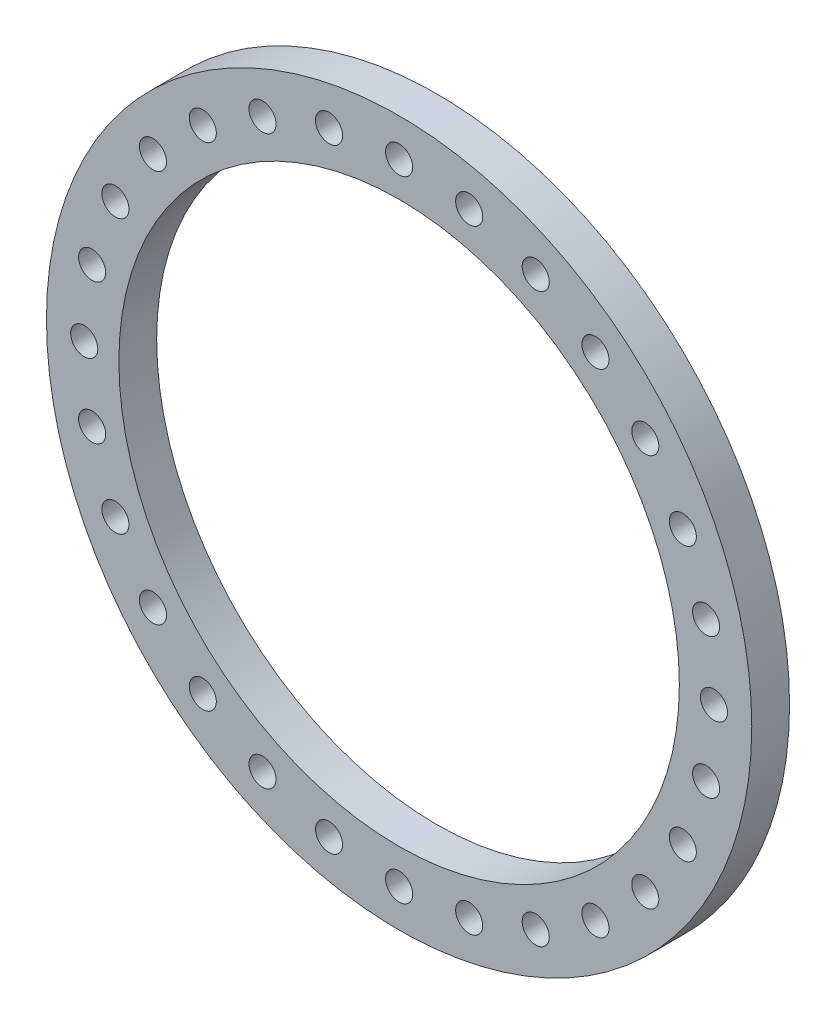
ISO-10303-21;
HEADER;
FILE_DESCRIPTION(('STEP AP214'),'2;1');
FILE_NAME('part.step','',(''),(''),'','','');
FILE_SCHEMA(('AUTOMOTIVE_DESIGN { 1 0 10303 214 1 1 1 1 }'));
ENDSEC;
DATA;
#1=APPLICATION_CONTEXT('core data for automotive mechanical design processes');
#2=APPLICATION_PROTOCOL_DEFINITION('international standard','automotive_design',2000,#1);
#3=PRODUCT_CONTEXT('',#1,'mechanical');
#4=PRODUCT('Part','Part','',(#3));
#5=PRODUCT_RELATED_PRODUCT_CATEGORY('part','',(#4));
#6=PRODUCT_DEFINITION_FORMATION('','',#4);
#7=PRODUCT_DEFINITION_CONTEXT('part definition',#1,'design');
#8=PRODUCT_DEFINITION('design','',#6,#7);
#9=PRODUCT_DEFINITION_SHAPE('','',#8);
#10=(LENGTH_UNIT() NAMED_UNIT(*) SI_UNIT(.MILLI.,.METRE.));
#11=(NAMED_UNIT(*) PLANE_ANGLE_UNIT() SI_UNIT($,.RADIAN.));
#12=(NAMED_UNIT(*) SI_UNIT($,.STERADIAN.) SOLID_ANGLE_UNIT());
#13=UNCERTAINTY_MEASURE_WITH_UNIT(LENGTH_MEASURE(1.E-05),#10,'distance_accuracy_value','');
#14=(GEOMETRIC_REPRESENTATION_CONTEXT(3) GLOBAL_UNCERTAINTY_ASSIGNED_CONTEXT((#13)) GLOBAL_UNIT_ASSIGNED_CONTEXT((#10,
#11,#12)) REPRESENTATION_CONTEXT('',''));
#15=CARTESIAN_POINT('',(0.,0.,0.));
#16=DIRECTION('',(0.,0.,1.));
#17=DIRECTION('',(1.,0.,0.));
#18=AXIS2_PLACEMENT_3D('',#15,#16,#17);
#19=CARTESIAN_POINT('',(0.,0.,6.));
#20=DIRECTION('',(0.,0.,-1.));
#21=DIRECTION('',(-1.,0.,0.));
#22=AXIS2_PLACEMENT_3D('',#19,#20,#21);
#23=CYLINDRICAL_SURFACE('',#22,56.);
#24=CARTESIAN_POINT('',(0.,0.,6.));
#25=DIRECTION('',(0.,0.,-1.));
#26=DIRECTION('',(1.,0.,0.));
#27=AXIS2_PLACEMENT_3D('',#24,#25,#26);
#28=CIRCLE('',#27,56.);
#29=CARTESIAN_POINT('',(56.,0.,6.));
#30=VERTEX_POINT('',#29);
#31=EDGE_CURVE('E10',#30,#30,#28,.T.);
#32=ORIENTED_EDGE('',*,*,#31,.T.);
#33=EDGE_LOOP('',(#32));
#34=FACE_BOUND('',#33,.T.);
#35=CARTESIAN_POINT('',(0.,0.,0.));
#36=DIRECTION('',(0.,0.,-1.));
#37=DIRECTION('',(1.,0.,0.));
#38=AXIS2_PLACEMENT_3D('',#35,#36,#37);
#39=CIRCLE('',#38,56.);
#40=CARTESIAN_POINT('',(56.,0.,0.));
#41=VERTEX_POINT('',#40);
#42=EDGE_CURVE('E42',#41,#41,#39,.T.);
#43=ORIENTED_EDGE('',*,*,#42,.F.);
#44=EDGE_LOOP('',(#43));
#45=FACE_BOUND('',#44,.T.);
#46=ADVANCED_FACE('F39',(#34,#45),#23,.T.);
#47=CARTESIAN_POINT('',(0.,0.,6.));
#48=DIRECTION('',(0.,0.,1.));
#49=DIRECTION('',(1.,0.,0.));
#50=AXIS2_PLACEMENT_3D('',#47,#48,#49);
#51=PLANE('',#50);
#52=CARTESIAN_POINT('',(0.,0.,6.));
#53=DIRECTION('',(0.,0.,-1.));
#54=DIRECTION('',(1.,0.,0.));
#55=AXIS2_PLACEMENT_3D('',#52,#53,#54);
#56=CIRCLE('',#55,44.5);
#57=CARTESIAN_POINT('',(44.5,0.,6.));
#58=VERTEX_POINT('',#57);
#59=EDGE_CURVE('E216',#58,#58,#56,.T.);
#60=ORIENTED_EDGE('',*,*,#59,.T.);
#61=EDGE_LOOP('',(#60));
#62=FACE_BOUND('',#61,.T.);
#63=CARTESIAN_POINT('',(0.,50.,6.));
#64=DIRECTION('',(0.,0.,-1.));
#65=DIRECTION('',(1.,0.,0.));
#66=AXIS2_PLACEMENT_3D('',#63,#64,#65);
#67=CIRCLE('',#66,2.15);
#68=CARTESIAN_POINT('',(2.15,50.,6.));
#69=VERTEX_POINT('',#68);
#70=EDGE_CURVE('E210',#69,#69,#67,.T.);
#71=ORIENTED_EDGE('',*,*,#70,.T.);
#72=EDGE_LOOP('',(#71));
#73=FACE_BOUND('',#72,.T.);
#74=CARTESIAN_POINT('',(11.1260466978157,48.7463956090912,6.));
#75=DIRECTION('',(0.,0.,-1.));
#76=DIRECTION('',(1.,0.,0.));
#77=AXIS2_PLACEMENT_3D('',#74,#75,#76);
#78=CIRCLE('',#77,2.15);
#79=CARTESIAN_POINT('',(13.2760466978157,48.7463956090912,6.));
#80=VERTEX_POINT('',#79);
#81=EDGE_CURVE('E204',#80,#80,#78,.T.);
#82=ORIENTED_EDGE('',*,*,#81,.T.);
#83=EDGE_LOOP('',(#82));
#84=FACE_BOUND('',#83,.T.);
#85=CARTESIAN_POINT('',(21.6941869558779,45.048443395121,6.));
#86=DIRECTION('',(0.,0.,-1.));
#87=DIRECTION('',(1.,0.,0.));
#88=AXIS2_PLACEMENT_3D('',#85,#86,#87);
#89=CIRCLE('',#88,2.15);
#90=CARTESIAN_POINT('',(23.8441869558779,45.048443395121,6.));
#91=VERTEX_POINT('',#90);
#92=EDGE_CURVE('E198',#91,#91,#89,.T.);
#93=ORIENTED_EDGE('',*,*,#92,.T.);
#94=EDGE_LOOP('',(#93));
#95=FACE_BOUND('',#94,.T.);
#96=CARTESIAN_POINT('',(31.1744900929367,39.0915741234015,6.));
#97=DIRECTION('',(0.,0.,-1.));
#98=DIRECTION('',(1.,0.,0.));
#99=AXIS2_PLACEMENT_3D('',#96,#97,#98);
#100=CIRCLE('',#99,2.15);
#101=CARTESIAN_POINT('',(33.3244900929367,39.0915741234015,6.));
#102=VERTEX_POINT('',#101);
#103=EDGE_CURVE('E192',#102,#102,#100,.T.);
#104=ORIENTED_EDGE('',*,*,#103,.T.);
#105=EDGE_LOOP('',(#104));
#106=FACE_BOUND('',#105,.T.);
#107=CARTESIAN_POINT('',(39.0915741234015,31.1744900929367,6.));
#108=DIRECTION('',(0.,0.,-1.));
#109=DIRECTION('',(1.,0.,0.));
#110=AXIS2_PLACEMENT_3D('',#107,#108,#109);
#111=CIRCLE('',#110,2.15);
#112=CARTESIAN_POINT('',(41.2415741234015,31.1744900929367,6.));
#113=VERTEX_POINT('',#112);
#114=EDGE_CURVE('E186',#113,#113,#111,.T.);
#115=ORIENTED_EDGE('',*,*,#114,.T.);
#116=EDGE_LOOP('',(#115));
#117=FACE_BOUND('',#116,.T.);
#118=CARTESIAN_POINT('',(45.048443395121,21.6941869558779,6.));
#119=DIRECTION('',(0.,0.,-1.));
#120=DIRECTION('',(1.,0.,0.));
#121=AXIS2_PLACEMENT_3D('',#118,#119,#120);
#122=CIRCLE('',#121,2.15);
#123=CARTESIAN_POINT('',(47.198443395121,21.6941869558779,6.));
#124=VERTEX_POINT('',#123);
#125=EDGE_CURVE('E180',#124,#124,#122,.T.);
#126=ORIENTED_EDGE('',*,*,#125,.T.);
#127=EDGE_LOOP('',(#126));
#128=FACE_BOUND('',#127,.T.);
#129=CARTESIAN_POINT('',(48.7463956090912,11.1260466978157,6.));
#130=DIRECTION('',(0.,0.,-1.));
#131=DIRECTION('',(1.,0.,0.));
#132=AXIS2_PLACEMENT_3D('',#129,#130,#131);
#133=CIRCLE('',#132,2.15);
#134=CARTESIAN_POINT('',(50.8963956090912,11.1260466978157,6.));
#135=VERTEX_POINT('',#134);
#136=EDGE_CURVE('E174',#135,#135,#133,.T.);
#137=ORIENTED_EDGE('',*,*,#136,.T.);
#138=EDGE_LOOP('',(#137));
#139=FACE_BOUND('',#138,.T.);
#140=CARTESIAN_POINT('',(50.,0.,6.));
#141=DIRECTION('',(0.,0.,-1.));
#142=DIRECTION('',(1.,0.,0.));
#143=AXIS2_PLACEMENT_3D('',#140,#141,#142);
#144=CIRCLE('',#143,2.15);
#145=CARTESIAN_POINT('',(52.15,0.,6.));
#146=VERTEX_POINT('',#145);
#147=EDGE_CURVE('E168',#146,#146,#144,.T.);
#148=ORIENTED_EDGE('',*,*,#147,.T.);
#149=EDGE_LOOP('',(#148));
#150=FACE_BOUND('',#149,.T.);
#151=CARTESIAN_POINT('',(48.7463956090912,-11.1260466978157,6.));
#152=DIRECTION('',(0.,0.,-1.));
#153=DIRECTION('',(1.,0.,0.));
#154=AXIS2_PLACEMENT_3D('',#151,#152,#153);
#155=CIRCLE('',#154,2.15);
#156=CARTESIAN_POINT('',(50.8963956090912,-11.1260466978157,6.));
#157=VERTEX_POINT('',#156);
#158=EDGE_CURVE('E162',#157,#157,#155,.T.);
#159=ORIENTED_EDGE('',*,*,#158,.T.);
#160=EDGE_LOOP('',(#159));
#161=FACE_BOUND('',#160,.T.);
#162=CARTESIAN_POINT('',(45.048443395121,-21.6941869558779,6.));
#163=DIRECTION('',(0.,0.,-1.));
#164=DIRECTION('',(1.,0.,0.));
#165=AXIS2_PLACEMENT_3D('',#162,#163,#164);
#166=CIRCLE('',#165,2.15);
#167=CARTESIAN_POINT('',(47.198443395121,-21.6941869558779,6.));
#168=VERTEX_POINT('',#167);
#169=EDGE_CURVE('E156',#168,#168,#166,.T.);
#170=ORIENTED_EDGE('',*,*,#169,.T.);
#171=EDGE_LOOP('',(#170));
#172=FACE_BOUND('',#171,.T.);
#173=CARTESIAN_POINT('',(39.0915741234015,-31.1744900929367,6.));
#174=DIRECTION('',(0.,0.,-1.));
#175=DIRECTION('',(1.,0.,0.));
#176=AXIS2_PLACEMENT_3D('',#173,#174,#175);
#177=CIRCLE('',#176,2.15);
#178=CARTESIAN_POINT('',(41.2415741234015,-31.1744900929367,6.));
#179=VERTEX_POINT('',#178);
#180=EDGE_CURVE('E150',#179,#179,#177,.T.);
#181=ORIENTED_EDGE('',*,*,#180,.T.);
#182=EDGE_LOOP('',(#181));
#183=FACE_BOUND('',#182,.T.);
#184=CARTESIAN_POINT('',(31.1744900929367,-39.0915741234015,6.));
#185=DIRECTION('',(0.,0.,-1.));
#186=DIRECTION('',(1.,0.,0.));
#187=AXIS2_PLACEMENT_3D('',#184,#185,#186);
#188=CIRCLE('',#187,2.15);
#189=CARTESIAN_POINT('',(33.3244900929367,-39.0915741234015,6.));
#190=VERTEX_POINT('',#189);
#191=EDGE_CURVE('E144',#190,#190,#188,.T.);
#192=ORIENTED_EDGE('',*,*,#191,.T.);
#193=EDGE_LOOP('',(#192));
#194=FACE_BOUND('',#193,.T.);
#195=CARTESIAN_POINT('',(21.6941869558779,-45.048443395121,6.));
#196=DIRECTION('',(0.,0.,-1.));
#197=DIRECTION('',(1.,0.,0.));
#198=AXIS2_PLACEMENT_3D('',#195,#196,#197);
#199=CIRCLE('',#198,2.15);
#200=CARTESIAN_POINT('',(23.8441869558779,-45.048443395121,6.));
#201=VERTEX_POINT('',#200);
#202=EDGE_CURVE('E138',#201,#201,#199,.T.);
#203=ORIENTED_EDGE('',*,*,#202,.T.);
#204=EDGE_LOOP('',(#203));
#205=FACE_BOUND('',#204,.T.);
#206=CARTESIAN_POINT('',(11.1260466978157,-48.7463956090912,6.));
#207=DIRECTION('',(0.,0.,-1.));
#208=DIRECTION('',(1.,0.,0.));
#209=AXIS2_PLACEMENT_3D('',#206,#207,#208);
#210=CIRCLE('',#209,2.15);
#211=CARTESIAN_POINT('',(13.2760466978157,-48.7463956090912,6.));
#212=VERTEX_POINT('',#211);
#213=EDGE_CURVE('E132',#212,#212,#210,.T.);
#214=ORIENTED_EDGE('',*,*,#213,.T.);
#215=EDGE_LOOP('',(#214));
#216=FACE_BOUND('',#215,.T.);
#217=CARTESIAN_POINT('',(0.,-50.,6.));
#218=DIRECTION('',(0.,0.,-1.));
#219=DIRECTION('',(1.,0.,0.));
#220=AXIS2_PLACEMENT_3D('',#217,#218,#219);
#221=CIRCLE('',#220,2.15);
#222=CARTESIAN_POINT('',(2.15000000000001,-50.,6.));
#223=VERTEX_POINT('',#222);
#224=EDGE_CURVE('E126',#223,#223,#221,.T.);
#225=ORIENTED_EDGE('',*,*,#224,.T.);
#226=EDGE_LOOP('',(#225));
#227=FACE_BOUND('',#226,.T.);
#228=CARTESIAN_POINT('',(-11.1260466978157,-48.7463956090912,6.));
#229=DIRECTION('',(0.,0.,-1.));
#230=DIRECTION('',(1.,0.,0.));
#231=AXIS2_PLACEMENT_3D('',#228,#229,#230);
#232=CIRCLE('',#231,2.15);
#233=CARTESIAN_POINT('',(-8.9760466978157,-48.7463956090912,6.));
#234=VERTEX_POINT('',#233);
#235=EDGE_CURVE('E120',#234,#234,#232,.T.);
#236=ORIENTED_EDGE('',*,*,#235,.T.);
#237=EDGE_LOOP('',(#236));
#238=FACE_BOUND('',#237,.T.);
#239=CARTESIAN_POINT('',(-21.6941869558779,-45.048443395121,6.));
#240=DIRECTION('',(0.,0.,-1.));
#241=DIRECTION('',(1.,0.,0.));
#242=AXIS2_PLACEMENT_3D('',#239,#240,#241);
#243=CIRCLE('',#242,2.15);
#244=CARTESIAN_POINT('',(-19.5441869558779,-45.048443395121,6.));
#245=VERTEX_POINT('',#244);
#246=EDGE_CURVE('E114',#245,#245,#243,.T.);
#247=ORIENTED_EDGE('',*,*,#246,.T.);
#248=EDGE_LOOP('',(#247));
#249=FACE_BOUND('',#248,.T.);
#250=CARTESIAN_POINT('',(-31.1744900929367,-39.0915741234015,6.));
#251=DIRECTION('',(0.,0.,-1.));
#252=DIRECTION('',(1.,0.,0.));
#253=AXIS2_PLACEMENT_3D('',#250,#251,#252);
#254=CIRCLE('',#253,2.15);
#255=CARTESIAN_POINT('',(-29.0244900929367,-39.0915741234015,6.));
#256=VERTEX_POINT('',#255);
#257=EDGE_CURVE('E108',#256,#256,#254,.T.);
#258=ORIENTED_EDGE('',*,*,#257,.T.);
#259=EDGE_LOOP('',(#258));
#260=FACE_BOUND('',#259,.T.);
#261=CARTESIAN_POINT('',(-39.0915741234015,-31.1744900929367,6.));
#262=DIRECTION('',(0.,0.,-1.));
#263=DIRECTION('',(1.,0.,0.));
#264=AXIS2_PLACEMENT_3D('',#261,#262,#263);
#265=CIRCLE('',#264,2.15);
#266=CARTESIAN_POINT('',(-36.9415741234015,-31.1744900929367,6.));
#267=VERTEX_POINT('',#266);
#268=EDGE_CURVE('E102',#267,#267,#265,.T.);
#269=ORIENTED_EDGE('',*,*,#268,.T.);
#270=EDGE_LOOP('',(#269));
#271=FACE_BOUND('',#270,.T.);
#272=CARTESIAN_POINT('',(-45.048443395121,-21.6941869558779,6.));
#273=DIRECTION('',(0.,0.,-1.));
#274=DIRECTION('',(1.,0.,0.));
#275=AXIS2_PLACEMENT_3D('',#272,#273,#274);
#276=CIRCLE('',#275,2.15);
#277=CARTESIAN_POINT('',(-42.898443395121,-21.6941869558779,6.));
#278=VERTEX_POINT('',#277);
#279=EDGE_CURVE('E96',#278,#278,#276,.T.);
#280=ORIENTED_EDGE('',*,*,#279,.T.);
#281=EDGE_LOOP('',(#280));
#282=FACE_BOUND('',#281,.T.);
#283=CARTESIAN_POINT('',(-48.7463956090912,-11.1260466978157,6.));
#284=DIRECTION('',(0.,0.,-1.));
#285=DIRECTION('',(1.,0.,0.));
#286=AXIS2_PLACEMENT_3D('',#283,#284,#285);
#287=CIRCLE('',#286,2.15);
#288=CARTESIAN_POINT('',(-46.5963956090912,-11.1260466978157,6.));
#289=VERTEX_POINT('',#288);
#290=EDGE_CURVE('E90',#289,#289,#287,.T.);
#291=ORIENTED_EDGE('',*,*,#290,.T.);
#292=EDGE_LOOP('',(#291));
#293=FACE_BOUND('',#292,.T.);
#294=CARTESIAN_POINT('',(-50.,0.,6.));
#295=DIRECTION('',(0.,0.,-1.));
#296=DIRECTION('',(1.,0.,0.));
#297=AXIS2_PLACEMENT_3D('',#294,#295,#296);
#298=CIRCLE('',#297,2.15);
#299=CARTESIAN_POINT('',(-47.85,0.,6.));
#300=VERTEX_POINT('',#299);
#301=EDGE_CURVE('E84',#300,#300,#298,.T.);
#302=ORIENTED_EDGE('',*,*,#301,.T.);
#303=EDGE_LOOP('',(#302));
#304=FACE_BOUND('',#303,.T.);
#305=CARTESIAN_POINT('',(-48.7463956090912,11.1260466978157,6.));
#306=DIRECTION('',(0.,0.,-1.));
#307=DIRECTION('',(1.,0.,0.));
#308=AXIS2_PLACEMENT_3D('',#305,#306,#307);
#309=CIRCLE('',#308,2.15);
#310=CARTESIAN_POINT('',(-46.5963956090912,11.1260466978157,6.));
#311=VERTEX_POINT('',#310);
#312=EDGE_CURVE('E78',#311,#311,#309,.T.);
#313=ORIENTED_EDGE('',*,*,#312,.T.);
#314=EDGE_LOOP('',(#313));
#315=FACE_BOUND('',#314,.T.);
#316=CARTESIAN_POINT('',(-45.048443395121,21.6941869558779,6.));
#317=DIRECTION('',(0.,0.,-1.));
#318=DIRECTION('',(1.,0.,0.));
#319=AXIS2_PLACEMENT_3D('',#316,#317,#318);
#320=CIRCLE('',#319,2.15);
#321=CARTESIAN_POINT('',(-42.898443395121,21.6941869558779,6.));
#322=VERTEX_POINT('',#321);
#323=EDGE_CURVE('E72',#322,#322,#320,.T.);
#324=ORIENTED_EDGE('',*,*,#323,.T.);
#325=EDGE_LOOP('',(#324));
#326=FACE_BOUND('',#325,.T.);
#327=CARTESIAN_POINT('',(-39.0915741234015,31.1744900929367,6.));
#328=DIRECTION('',(0.,0.,-1.));
#329=DIRECTION('',(1.,0.,0.));
#330=AXIS2_PLACEMENT_3D('',#327,#328,#329);
#331=CIRCLE('',#330,2.15);
#332=CARTESIAN_POINT('',(-36.9415741234015,31.1744900929367,6.));
#333=VERTEX_POINT('',#332);
#334=EDGE_CURVE('E66',#333,#333,#331,.T.);
#335=ORIENTED_EDGE('',*,*,#334,.T.);
#336=EDGE_LOOP('',(#335));
#337=FACE_BOUND('',#336,.T.);
#338=CARTESIAN_POINT('',(-31.1744900929367,39.0915741234015,6.));
#339=DIRECTION('',(0.,0.,-1.));
#340=DIRECTION('',(1.,0.,0.));
#341=AXIS2_PLACEMENT_3D('',#338,#339,#340);
#342=CIRCLE('',#341,2.15);
#343=CARTESIAN_POINT('',(-29.0244900929367,39.0915741234015,6.));
#344=VERTEX_POINT('',#343);
#345=EDGE_CURVE('E60',#344,#344,#342,.T.);
#346=ORIENTED_EDGE('',*,*,#345,.T.);
#347=EDGE_LOOP('',(#346));
#348=FACE_BOUND('',#347,.T.);
#349=CARTESIAN_POINT('',(-21.6941869558779,45.048443395121,6.));
#350=DIRECTION('',(0.,0.,-1.));
#351=DIRECTION('',(1.,0.,0.));
#352=AXIS2_PLACEMENT_3D('',#349,#350,#351);
#353=CIRCLE('',#352,2.15);
#354=CARTESIAN_POINT('',(-19.5441869558779,45.048443395121,6.));
#355=VERTEX_POINT('',#354);
#356=EDGE_CURVE('E54',#355,#355,#353,.T.);
#357=ORIENTED_EDGE('',*,*,#356,.T.);
#358=EDGE_LOOP('',(#357));
#359=FACE_BOUND('',#358,.T.);
#360=CARTESIAN_POINT('',(-11.1260466978157,48.7463956090912,6.));
#361=DIRECTION('',(0.,0.,-1.));
#362=DIRECTION('',(1.,0.,0.));
#363=AXIS2_PLACEMENT_3D('',#360,#361,#362);
#364=CIRCLE('',#363,2.15);
#365=CARTESIAN_POINT('',(-8.97604669781572,48.7463956090912,6.));
#366=VERTEX_POINT('',#365);
#367=EDGE_CURVE('E49',#366,#366,#364,.T.);
#368=ORIENTED_EDGE('',*,*,#367,.T.);
#369=EDGE_LOOP('',(#368));
#370=FACE_BOUND('',#369,.T.);
#371=ORIENTED_EDGE('',*,*,#31,.F.);
#372=EDGE_LOOP('',(#371));
#373=FACE_BOUND('',#372,.T.);
#374=ADVANCED_FACE('F225',(#62,#73,#84,#95,#106,#117,#128,#139,#150,#161,#172,#183,#194,#205,
#216,#227,#238,#249,#260,#271,#282,#293,#304,#315,#326,#337,#348,#359,#370,#373),#51,.T.);
#375=CARTESIAN_POINT('',(0.,0.,0.));
#376=DIRECTION('',(0.,0.,1.));
#377=DIRECTION('',(1.,0.,0.));
#378=AXIS2_PLACEMENT_3D('',#375,#376,#377);
#379=PLANE('',#378);
#380=CARTESIAN_POINT('',(0.,0.,0.));
#381=DIRECTION('',(0.,0.,-1.));
#382=DIRECTION('',(1.,0.,0.));
#383=AXIS2_PLACEMENT_3D('',#380,#381,#382);
#384=CIRCLE('',#383,44.5);
#385=CARTESIAN_POINT('',(44.5,0.,0.));
#386=VERTEX_POINT('',#385);
#387=EDGE_CURVE('E219',#386,#386,#384,.T.);
#388=ORIENTED_EDGE('',*,*,#387,.F.);
#389=EDGE_LOOP('',(#388));
#390=FACE_BOUND('',#389,.T.);
#391=CARTESIAN_POINT('',(0.,50.,0.));
#392=DIRECTION('',(0.,0.,-1.));
#393=DIRECTION('',(1.,0.,0.));
#394=AXIS2_PLACEMENT_3D('',#391,#392,#393);
#395=CIRCLE('',#394,2.15);
#396=CARTESIAN_POINT('',(2.15,50.,0.));
#397=VERTEX_POINT('',#396);
#398=EDGE_CURVE('E213',#397,#397,#395,.T.);
#399=ORIENTED_EDGE('',*,*,#398,.F.);
#400=EDGE_LOOP('',(#399));
#401=FACE_BOUND('',#400,.T.);
#402=CARTESIAN_POINT('',(11.1260466978157,48.7463956090912,0.));
#403=DIRECTION('',(0.,0.,-1.));
#404=DIRECTION('',(1.,0.,0.));
#405=AXIS2_PLACEMENT_3D('',#402,#403,#404);
#406=CIRCLE('',#405,2.15);
#407=CARTESIAN_POINT('',(13.2760466978157,48.7463956090912,0.));
#408=VERTEX_POINT('',#407);
#409=EDGE_CURVE('E207',#408,#408,#406,.T.);
#410=ORIENTED_EDGE('',*,*,#409,.F.);
#411=EDGE_LOOP('',(#410));
#412=FACE_BOUND('',#411,.T.);
#413=CARTESIAN_POINT('',(21.6941869558779,45.048443395121,0.));
#414=DIRECTION('',(0.,0.,-1.));
#415=DIRECTION('',(1.,0.,0.));
#416=AXIS2_PLACEMENT_3D('',#413,#414,#415);
#417=CIRCLE('',#416,2.15);
#418=CARTESIAN_POINT('',(23.8441869558779,45.048443395121,0.));
#419=VERTEX_POINT('',#418);
#420=EDGE_CURVE('E201',#419,#419,#417,.T.);
#421=ORIENTED_EDGE('',*,*,#420,.F.);
#422=EDGE_LOOP('',(#421));
#423=FACE_BOUND('',#422,.T.);
#424=CARTESIAN_POINT('',(31.1744900929367,39.0915741234015,0.));
#425=DIRECTION('',(0.,0.,-1.));
#426=DIRECTION('',(1.,0.,0.));
#427=AXIS2_PLACEMENT_3D('',#424,#425,#426);
#428=CIRCLE('',#427,2.15);
#429=CARTESIAN_POINT('',(33.3244900929367,39.0915741234015,0.));
#430=VERTEX_POINT('',#429);
#431=EDGE_CURVE('E195',#430,#430,#428,.T.);
#432=ORIENTED_EDGE('',*,*,#431,.F.);
#433=EDGE_LOOP('',(#432));
#434=FACE_BOUND('',#433,.T.);
#435=CARTESIAN_POINT('',(39.0915741234015,31.1744900929367,0.));
#436=DIRECTION('',(0.,0.,-1.));
#437=DIRECTION('',(1.,0.,0.));
#438=AXIS2_PLACEMENT_3D('',#435,#436,#437);
#439=CIRCLE('',#438,2.15);
#440=CARTESIAN_POINT('',(41.2415741234015,31.1744900929367,0.));
#441=VERTEX_POINT('',#440);
#442=EDGE_CURVE('E189',#441,#441,#439,.T.);
#443=ORIENTED_EDGE('',*,*,#442,.F.);
#444=EDGE_LOOP('',(#443));
#445=FACE_BOUND('',#444,.T.);
#446=CARTESIAN_POINT('',(45.048443395121,21.6941869558779,0.));
#447=DIRECTION('',(0.,0.,-1.));
#448=DIRECTION('',(1.,0.,0.));
#449=AXIS2_PLACEMENT_3D('',#446,#447,#448);
#450=CIRCLE('',#449,2.15);
#451=CARTESIAN_POINT('',(47.198443395121,21.6941869558779,0.));
#452=VERTEX_POINT('',#451);
#453=EDGE_CURVE('E183',#452,#452,#450,.T.);
#454=ORIENTED_EDGE('',*,*,#453,.F.);
#455=EDGE_LOOP('',(#454));
#456=FACE_BOUND('',#455,.T.);
#457=CARTESIAN_POINT('',(48.7463956090912,11.1260466978157,0.));
#458=DIRECTION('',(0.,0.,-1.));
#459=DIRECTION('',(1.,0.,0.));
#460=AXIS2_PLACEMENT_3D('',#457,#458,#459);
#461=CIRCLE('',#460,2.15);
#462=CARTESIAN_POINT('',(50.8963956090912,11.1260466978157,0.));
#463=VERTEX_POINT('',#462);
#464=EDGE_CURVE('E177',#463,#463,#461,.T.);
#465=ORIENTED_EDGE('',*,*,#464,.F.);
#466=EDGE_LOOP('',(#465));
#467=FACE_BOUND('',#466,.T.);
#468=CARTESIAN_POINT('',(50.,0.,0.));
#469=DIRECTION('',(0.,0.,-1.));
#470=DIRECTION('',(1.,0.,0.));
#471=AXIS2_PLACEMENT_3D('',#468,#469,#470);
#472=CIRCLE('',#471,2.15);
#473=CARTESIAN_POINT('',(52.15,0.,0.));
#474=VERTEX_POINT('',#473);
#475=EDGE_CURVE('E171',#474,#474,#472,.T.);
#476=ORIENTED_EDGE('',*,*,#475,.F.);
#477=EDGE_LOOP('',(#476));
#478=FACE_BOUND('',#477,.T.);
#479=CARTESIAN_POINT('',(48.7463956090912,-11.1260466978157,0.));
#480=DIRECTION('',(0.,0.,-1.));
#481=DIRECTION('',(1.,0.,0.));
#482=AXIS2_PLACEMENT_3D('',#479,#480,#481);
#483=CIRCLE('',#482,2.15);
#484=CARTESIAN_POINT('',(50.8963956090912,-11.1260466978157,0.));
#485=VERTEX_POINT('',#484);
#486=EDGE_CURVE('E165',#485,#485,#483,.T.);
#487=ORIENTED_EDGE('',*,*,#486,.F.);
#488=EDGE_LOOP('',(#487));
#489=FACE_BOUND('',#488,.T.);
#490=CARTESIAN_POINT('',(45.048443395121,-21.6941869558779,0.));
#491=DIRECTION('',(0.,0.,-1.));
#492=DIRECTION('',(1.,0.,0.));
#493=AXIS2_PLACEMENT_3D('',#490,#491,#492);
#494=CIRCLE('',#493,2.15);
#495=CARTESIAN_POINT('',(47.198443395121,-21.6941869558779,0.));
#496=VERTEX_POINT('',#495);
#497=EDGE_CURVE('E159',#496,#496,#494,.T.);
#498=ORIENTED_EDGE('',*,*,#497,.F.);
#499=EDGE_LOOP('',(#498));
#500=FACE_BOUND('',#499,.T.);
#501=CARTESIAN_POINT('',(39.0915741234015,-31.1744900929367,0.));
#502=DIRECTION('',(0.,0.,-1.));
#503=DIRECTION('',(1.,0.,0.));
#504=AXIS2_PLACEMENT_3D('',#501,#502,#503);
#505=CIRCLE('',#504,2.15);
#506=CARTESIAN_POINT('',(41.2415741234015,-31.1744900929367,0.));
#507=VERTEX_POINT('',#506);
#508=EDGE_CURVE('E153',#507,#507,#505,.T.);
#509=ORIENTED_EDGE('',*,*,#508,.F.);
#510=EDGE_LOOP('',(#509));
#511=FACE_BOUND('',#510,.T.);
#512=CARTESIAN_POINT('',(31.1744900929367,-39.0915741234015,0.));
#513=DIRECTION('',(0.,0.,-1.));
#514=DIRECTION('',(1.,0.,0.));
#515=AXIS2_PLACEMENT_3D('',#512,#513,#514);
#516=CIRCLE('',#515,2.15);
#517=CARTESIAN_POINT('',(33.3244900929367,-39.0915741234015,0.));
#518=VERTEX_POINT('',#517);
#519=EDGE_CURVE('E147',#518,#518,#516,.T.);
#520=ORIENTED_EDGE('',*,*,#519,.F.);
#521=EDGE_LOOP('',(#520));
#522=FACE_BOUND('',#521,.T.);
#523=CARTESIAN_POINT('',(21.6941869558779,-45.048443395121,0.));
#524=DIRECTION('',(0.,0.,-1.));
#525=DIRECTION('',(1.,0.,0.));
#526=AXIS2_PLACEMENT_3D('',#523,#524,#525);
#527=CIRCLE('',#526,2.15);
#528=CARTESIAN_POINT('',(23.8441869558779,-45.048443395121,0.));
#529=VERTEX_POINT('',#528);
#530=EDGE_CURVE('E141',#529,#529,#527,.T.);
#531=ORIENTED_EDGE('',*,*,#530,.F.);
#532=EDGE_LOOP('',(#531));
#533=FACE_BOUND('',#532,.T.);
#534=CARTESIAN_POINT('',(11.1260466978157,-48.7463956090912,0.));
#535=DIRECTION('',(0.,0.,-1.));
#536=DIRECTION('',(1.,0.,0.));
#537=AXIS2_PLACEMENT_3D('',#534,#535,#536);
#538=CIRCLE('',#537,2.15);
#539=CARTESIAN_POINT('',(13.2760466978157,-48.7463956090912,0.));
#540=VERTEX_POINT('',#539);
#541=EDGE_CURVE('E135',#540,#540,#538,.T.);
#542=ORIENTED_EDGE('',*,*,#541,.F.);
#543=EDGE_LOOP('',(#542));
#544=FACE_BOUND('',#543,.T.);
#545=CARTESIAN_POINT('',(0.,-50.,0.));
#546=DIRECTION('',(0.,0.,-1.));
#547=DIRECTION('',(1.,0.,0.));
#548=AXIS2_PLACEMENT_3D('',#545,#546,#547);
#549=CIRCLE('',#548,2.15);
#550=CARTESIAN_POINT('',(2.15000000000001,-50.,0.));
#551=VERTEX_POINT('',#550);
#552=EDGE_CURVE('E129',#551,#551,#549,.T.);
#553=ORIENTED_EDGE('',*,*,#552,.F.);
#554=EDGE_LOOP('',(#553));
#555=FACE_BOUND('',#554,.T.);
#556=CARTESIAN_POINT('',(-11.1260466978157,-48.7463956090912,0.));
#557=DIRECTION('',(0.,0.,-1.));
#558=DIRECTION('',(1.,0.,0.));
#559=AXIS2_PLACEMENT_3D('',#556,#557,#558);
#560=CIRCLE('',#559,2.15);
#561=CARTESIAN_POINT('',(-8.9760466978157,-48.7463956090912,0.));
#562=VERTEX_POINT('',#561);
#563=EDGE_CURVE('E123',#562,#562,#560,.T.);
#564=ORIENTED_EDGE('',*,*,#563,.F.);
#565=EDGE_LOOP('',(#564));
#566=FACE_BOUND('',#565,.T.);
#567=CARTESIAN_POINT('',(-21.6941869558779,-45.048443395121,0.));
#568=DIRECTION('',(0.,0.,-1.));
#569=DIRECTION('',(1.,0.,0.));
#570=AXIS2_PLACEMENT_3D('',#567,#568,#569);
#571=CIRCLE('',#570,2.15);
#572=CARTESIAN_POINT('',(-19.5441869558779,-45.048443395121,0.));
#573=VERTEX_POINT('',#572);
#574=EDGE_CURVE('E117',#573,#573,#571,.T.);
#575=ORIENTED_EDGE('',*,*,#574,.F.);
#576=EDGE_LOOP('',(#575));
#577=FACE_BOUND('',#576,.T.);
#578=CARTESIAN_POINT('',(-31.1744900929367,-39.0915741234015,0.));
#579=DIRECTION('',(0.,0.,-1.));
#580=DIRECTION('',(1.,0.,0.));
#581=AXIS2_PLACEMENT_3D('',#578,#579,#580);
#582=CIRCLE('',#581,2.15);
#583=CARTESIAN_POINT('',(-29.0244900929367,-39.0915741234015,0.));
#584=VERTEX_POINT('',#583);
#585=EDGE_CURVE('E111',#584,#584,#582,.T.);
#586=ORIENTED_EDGE('',*,*,#585,.F.);
#587=EDGE_LOOP('',(#586));
#588=FACE_BOUND('',#587,.T.);
#589=CARTESIAN_POINT('',(-39.0915741234015,-31.1744900929367,0.));
#590=DIRECTION('',(0.,0.,-1.));
#591=DIRECTION('',(1.,0.,0.));
#592=AXIS2_PLACEMENT_3D('',#589,#590,#591);
#593=CIRCLE('',#592,2.15);
#594=CARTESIAN_POINT('',(-36.9415741234015,-31.1744900929367,0.));
#595=VERTEX_POINT('',#594);
#596=EDGE_CURVE('E105',#595,#595,#593,.T.);
#597=ORIENTED_EDGE('',*,*,#596,.F.);
#598=EDGE_LOOP('',(#597));
#599=FACE_BOUND('',#598,.T.);
#600=CARTESIAN_POINT('',(-45.048443395121,-21.6941869558779,0.));
#601=DIRECTION('',(0.,0.,-1.));
#602=DIRECTION('',(1.,0.,0.));
#603=AXIS2_PLACEMENT_3D('',#600,#601,#602);
#604=CIRCLE('',#603,2.15);
#605=CARTESIAN_POINT('',(-42.898443395121,-21.6941869558779,0.));
#606=VERTEX_POINT('',#605);
#607=EDGE_CURVE('E99',#606,#606,#604,.T.);
#608=ORIENTED_EDGE('',*,*,#607,.F.);
#609=EDGE_LOOP('',(#608));
#610=FACE_BOUND('',#609,.T.);
#611=CARTESIAN_POINT('',(-48.7463956090912,-11.1260466978157,0.));
#612=DIRECTION('',(0.,0.,-1.));
#613=DIRECTION('',(1.,0.,0.));
#614=AXIS2_PLACEMENT_3D('',#611,#612,#613);
#615=CIRCLE('',#614,2.15);
#616=CARTESIAN_POINT('',(-46.5963956090912,-11.1260466978157,0.));
#617=VERTEX_POINT('',#616);
#618=EDGE_CURVE('E93',#617,#617,#615,.T.);
#619=ORIENTED_EDGE('',*,*,#618,.F.);
#620=EDGE_LOOP('',(#619));
#621=FACE_BOUND('',#620,.T.);
#622=CARTESIAN_POINT('',(-50.,0.,0.));
#623=DIRECTION('',(0.,0.,-1.));
#624=DIRECTION('',(1.,0.,0.));
#625=AXIS2_PLACEMENT_3D('',#622,#623,#624);
#626=CIRCLE('',#625,2.15);
#627=CARTESIAN_POINT('',(-47.85,0.,0.));
#628=VERTEX_POINT('',#627);
#629=EDGE_CURVE('E87',#628,#628,#626,.T.);
#630=ORIENTED_EDGE('',*,*,#629,.F.);
#631=EDGE_LOOP('',(#630));
#632=FACE_BOUND('',#631,.T.);
#633=CARTESIAN_POINT('',(-48.7463956090912,11.1260466978157,0.));
#634=DIRECTION('',(0.,0.,-1.));
#635=DIRECTION('',(1.,0.,0.));
#636=AXIS2_PLACEMENT_3D('',#633,#634,#635);
#637=CIRCLE('',#636,2.15);
#638=CARTESIAN_POINT('',(-46.5963956090912,11.1260466978157,0.));
#639=VERTEX_POINT('',#638);
#640=EDGE_CURVE('E81',#639,#639,#637,.T.);
#641=ORIENTED_EDGE('',*,*,#640,.F.);
#642=EDGE_LOOP('',(#641));
#643=FACE_BOUND('',#642,.T.);
#644=CARTESIAN_POINT('',(-45.048443395121,21.6941869558779,0.));
#645=DIRECTION('',(0.,0.,-1.));
#646=DIRECTION('',(1.,0.,0.));
#647=AXIS2_PLACEMENT_3D('',#644,#645,#646);
#648=CIRCLE('',#647,2.15);
#649=CARTESIAN_POINT('',(-42.898443395121,21.6941869558779,0.));
#650=VERTEX_POINT('',#649);
#651=EDGE_CURVE('E75',#650,#650,#648,.T.);
#652=ORIENTED_EDGE('',*,*,#651,.F.);
#653=EDGE_LOOP('',(#652));
#654=FACE_BOUND('',#653,.T.);
#655=CARTESIAN_POINT('',(-39.0915741234015,31.1744900929367,0.));
#656=DIRECTION('',(0.,0.,-1.));
#657=DIRECTION('',(1.,0.,0.));
#658=AXIS2_PLACEMENT_3D('',#655,#656,#657);
#659=CIRCLE('',#658,2.15);
#660=CARTESIAN_POINT('',(-36.9415741234015,31.1744900929367,0.));
#661=VERTEX_POINT('',#660);
#662=EDGE_CURVE('E69',#661,#661,#659,.T.);
#663=ORIENTED_EDGE('',*,*,#662,.F.);
#664=EDGE_LOOP('',(#663));
#665=FACE_BOUND('',#664,.T.);
#666=CARTESIAN_POINT('',(-31.1744900929367,39.0915741234015,0.));
#667=DIRECTION('',(0.,0.,-1.));
#668=DIRECTION('',(1.,0.,0.));
#669=AXIS2_PLACEMENT_3D('',#666,#667,#668);
#670=CIRCLE('',#669,2.15);
#671=CARTESIAN_POINT('',(-29.0244900929367,39.0915741234015,0.));
#672=VERTEX_POINT('',#671);
#673=EDGE_CURVE('E63',#672,#672,#670,.T.);
#674=ORIENTED_EDGE('',*,*,#673,.F.);
#675=EDGE_LOOP('',(#674));
#676=FACE_BOUND('',#675,.T.);
#677=CARTESIAN_POINT('',(-21.6941869558779,45.048443395121,0.));
#678=DIRECTION('',(0.,0.,-1.));
#679=DIRECTION('',(1.,0.,0.));
#680=AXIS2_PLACEMENT_3D('',#677,#678,#679);
#681=CIRCLE('',#680,2.15);
#682=CARTESIAN_POINT('',(-19.5441869558779,45.048443395121,0.));
#683=VERTEX_POINT('',#682);
#684=EDGE_CURVE('E57',#683,#683,#681,.T.);
#685=ORIENTED_EDGE('',*,*,#684,.F.);
#686=EDGE_LOOP('',(#685));
#687=FACE_BOUND('',#686,.T.);
#688=CARTESIAN_POINT('',(-11.1260466978157,48.7463956090912,0.));
#689=DIRECTION('',(0.,0.,-1.));
#690=DIRECTION('',(1.,0.,0.));
#691=AXIS2_PLACEMENT_3D('',#688,#689,#690);
#692=CIRCLE('',#691,2.15);
#693=CARTESIAN_POINT('',(-8.97604669781572,48.7463956090912,0.));
#694=VERTEX_POINT('',#693);
#695=EDGE_CURVE('E51',#694,#694,#692,.T.);
#696=ORIENTED_EDGE('',*,*,#695,.F.);
#697=EDGE_LOOP('',(#696));
#698=FACE_BOUND('',#697,.T.);
#699=ORIENTED_EDGE('',*,*,#42,.T.);
#700=EDGE_LOOP('',(#699));
#701=FACE_BOUND('',#700,.T.);
#702=ADVANCED_FACE('F235',(#390,#401,#412,#423,#434,#445,#456,#467,#478,#489,#500,#511,#522,
#533,#544,#555,#566,#577,#588,#599,#610,#621,#632,#643,#654,#665,#676,#687,#698,#701),#379,.F.);
#703=CARTESIAN_POINT('',(-11.1260466978157,48.7463956090912,6.));
#704=DIRECTION('',(0.,0.,-1.));
#705=DIRECTION('',(-1.,0.,0.));
#706=AXIS2_PLACEMENT_3D('',#703,#704,#705);
#707=CYLINDRICAL_SURFACE('',#706,2.15);
#708=ORIENTED_EDGE('',*,*,#367,.F.);
#709=EDGE_LOOP('',(#708));
#710=FACE_BOUND('',#709,.T.);
#711=ORIENTED_EDGE('',*,*,#695,.T.);
#712=EDGE_LOOP('',(#711));
#713=FACE_BOUND('',#712,.T.);
#714=ADVANCED_FACE('F238',(#710,#713),#707,.F.);
#715=CARTESIAN_POINT('',(-21.6941869558779,45.048443395121,6.));
#716=DIRECTION('',(0.,0.,-1.));
#717=DIRECTION('',(-1.,0.,0.));
#718=AXIS2_PLACEMENT_3D('',#715,#716,#717);
#719=CYLINDRICAL_SURFACE('',#718,2.15);
#720=ORIENTED_EDGE('',*,*,#356,.F.);
#721=EDGE_LOOP('',(#720));
#722=FACE_BOUND('',#721,.T.);
#723=ORIENTED_EDGE('',*,*,#684,.T.);
#724=EDGE_LOOP('',(#723));
#725=FACE_BOUND('',#724,.T.);
#726=ADVANCED_FACE('F307',(#722,#725),#719,.F.);
#727=CARTESIAN_POINT('',(-31.1744900929367,39.0915741234015,6.));
#728=DIRECTION('',(0.,0.,-1.));
#729=DIRECTION('',(-1.,0.,0.));
#730=AXIS2_PLACEMENT_3D('',#727,#728,#729);
#731=CYLINDRICAL_SURFACE('',#730,2.15);
#732=ORIENTED_EDGE('',*,*,#345,.F.);
#733=EDGE_LOOP('',(#732));
#734=FACE_BOUND('',#733,.T.);
#735=ORIENTED_EDGE('',*,*,#673,.T.);
#736=EDGE_LOOP('',(#735));
#737=FACE_BOUND('',#736,.T.);
#738=ADVANCED_FACE('F311',(#734,#737),#731,.F.);
#739=CARTESIAN_POINT('',(-39.0915741234015,31.1744900929367,6.));
#740=DIRECTION('',(0.,0.,-1.));
#741=DIRECTION('',(-1.,0.,0.));
#742=AXIS2_PLACEMENT_3D('',#739,#740,#741);
#743=CYLINDRICAL_SURFACE('',#742,2.15);
#744=ORIENTED_EDGE('',*,*,#334,.F.);
#745=EDGE_LOOP('',(#744));
#746=FACE_BOUND('',#745,.T.);
#747=ORIENTED_EDGE('',*,*,#662,.T.);
#748=EDGE_LOOP('',(#747));
#749=FACE_BOUND('',#748,.T.);
#750=ADVANCED_FACE('F315',(#746,#749),#743,.F.);
#751=CARTESIAN_POINT('',(-45.048443395121,21.6941869558779,6.));
#752=DIRECTION('',(0.,0.,-1.));
#753=DIRECTION('',(-1.,0.,0.));
#754=AXIS2_PLACEMENT_3D('',#751,#752,#753);
#755=CYLINDRICAL_SURFACE('',#754,2.15);
#756=ORIENTED_EDGE('',*,*,#323,.F.);
#757=EDGE_LOOP('',(#756));
#758=FACE_BOUND('',#757,.T.);
#759=ORIENTED_EDGE('',*,*,#651,.T.);
#760=EDGE_LOOP('',(#759));
#761=FACE_BOUND('',#760,.T.);
#762=ADVANCED_FACE('F319',(#758,#761),#755,.F.);
#763=CARTESIAN_POINT('',(-48.7463956090912,11.1260466978157,6.));
#764=DIRECTION('',(0.,0.,-1.));
#765=DIRECTION('',(-1.,0.,0.));
#766=AXIS2_PLACEMENT_3D('',#763,#764,#765);
#767=CYLINDRICAL_SURFACE('',#766,2.15);
#768=ORIENTED_EDGE('',*,*,#312,.F.);
#769=EDGE_LOOP('',(#768));
#770=FACE_BOUND('',#769,.T.);
#771=ORIENTED_EDGE('',*,*,#640,.T.);
#772=EDGE_LOOP('',(#771));
#773=FACE_BOUND('',#772,.T.);
#774=ADVANCED_FACE('F323',(#770,#773),#767,.F.);
#775=CARTESIAN_POINT('',(-50.,0.,6.));
#776=DIRECTION('',(0.,0.,-1.));
#777=DIRECTION('',(-1.,0.,0.));
#778=AXIS2_PLACEMENT_3D('',#775,#776,#777);
#779=CYLINDRICAL_SURFACE('',#778,2.15);
#780=ORIENTED_EDGE('',*,*,#301,.F.);
#781=EDGE_LOOP('',(#780));
#782=FACE_BOUND('',#781,.T.);
#783=ORIENTED_EDGE('',*,*,#629,.T.);
#784=EDGE_LOOP('',(#783));
#785=FACE_BOUND('',#784,.T.);
#786=ADVANCED_FACE('F327',(#782,#785),#779,.F.);
#787=CARTESIAN_POINT('',(-48.7463956090912,-11.1260466978157,6.));
#788=DIRECTION('',(0.,0.,-1.));
#789=DIRECTION('',(-1.,0.,0.));
#790=AXIS2_PLACEMENT_3D('',#787,#788,#789);
#791=CYLINDRICAL_SURFACE('',#790,2.15);
#792=ORIENTED_EDGE('',*,*,#290,.F.);
#793=EDGE_LOOP('',(#792));
#794=FACE_BOUND('',#793,.T.);
#795=ORIENTED_EDGE('',*,*,#618,.T.);
#796=EDGE_LOOP('',(#795));
#797=FACE_BOUND('',#796,.T.);
#798=ADVANCED_FACE('F331',(#794,#797),#791,.F.);
#799=CARTESIAN_POINT('',(-45.048443395121,-21.6941869558779,6.));
#800=DIRECTION('',(0.,0.,-1.));
#801=DIRECTION('',(-1.,0.,0.));
#802=AXIS2_PLACEMENT_3D('',#799,#800,#801);
#803=CYLINDRICAL_SURFACE('',#802,2.15);
#804=ORIENTED_EDGE('',*,*,#279,.F.);
#805=EDGE_LOOP('',(#804));
#806=FACE_BOUND('',#805,.T.);
#807=ORIENTED_EDGE('',*,*,#607,.T.);
#808=EDGE_LOOP('',(#807));
#809=FACE_BOUND('',#808,.T.);
#810=ADVANCED_FACE('F335',(#806,#809),#803,.F.);
#811=CARTESIAN_POINT('',(-39.0915741234015,-31.1744900929367,6.));
#812=DIRECTION('',(0.,0.,-1.));
#813=DIRECTION('',(-1.,0.,0.));
#814=AXIS2_PLACEMENT_3D('',#811,#812,#813);
#815=CYLINDRICAL_SURFACE('',#814,2.15);
#816=ORIENTED_EDGE('',*,*,#268,.F.);
#817=EDGE_LOOP('',(#816));
#818=FACE_BOUND('',#817,.T.);
#819=ORIENTED_EDGE('',*,*,#596,.T.);
#820=EDGE_LOOP('',(#819));
#821=FACE_BOUND('',#820,.T.);
#822=ADVANCED_FACE('F339',(#818,#821),#815,.F.);
#823=CARTESIAN_POINT('',(-31.1744900929367,-39.0915741234015,6.));
#824=DIRECTION('',(0.,0.,-1.));
#825=DIRECTION('',(-1.,0.,0.));
#826=AXIS2_PLACEMENT_3D('',#823,#824,#825);
#827=CYLINDRICAL_SURFACE('',#826,2.15);
#828=ORIENTED_EDGE('',*,*,#257,.F.);
#829=EDGE_LOOP('',(#828));
#830=FACE_BOUND('',#829,.T.);
#831=ORIENTED_EDGE('',*,*,#585,.T.);
#832=EDGE_LOOP('',(#831));
#833=FACE_BOUND('',#832,.T.);
#834=ADVANCED_FACE('F343',(#830,#833),#827,.F.);
#835=CARTESIAN_POINT('',(-21.6941869558779,-45.048443395121,6.));
#836=DIRECTION('',(0.,0.,-1.));
#837=DIRECTION('',(-1.,0.,0.));
#838=AXIS2_PLACEMENT_3D('',#835,#836,#837);
#839=CYLINDRICAL_SURFACE('',#838,2.15);
#840=ORIENTED_EDGE('',*,*,#246,.F.);
#841=EDGE_LOOP('',(#840));
#842=FACE_BOUND('',#841,.T.);
#843=ORIENTED_EDGE('',*,*,#574,.T.);
#844=EDGE_LOOP('',(#843));
#845=FACE_BOUND('',#844,.T.);
#846=ADVANCED_FACE('F347',(#842,#845),#839,.F.);
#847=CARTESIAN_POINT('',(-11.1260466978157,-48.7463956090912,6.));
#848=DIRECTION('',(0.,0.,-1.));
#849=DIRECTION('',(-1.,0.,0.));
#850=AXIS2_PLACEMENT_3D('',#847,#848,#849);
#851=CYLINDRICAL_SURFACE('',#850,2.15);
#852=ORIENTED_EDGE('',*,*,#235,.F.);
#853=EDGE_LOOP('',(#852));
#854=FACE_BOUND('',#853,.T.);
#855=ORIENTED_EDGE('',*,*,#563,.T.);
#856=EDGE_LOOP('',(#855));
#857=FACE_BOUND('',#856,.T.);
#858=ADVANCED_FACE('F351',(#854,#857),#851,.F.);
#859=CARTESIAN_POINT('',(0.,-50.,6.));
#860=DIRECTION('',(0.,0.,-1.));
#861=DIRECTION('',(-1.,0.,0.));
#862=AXIS2_PLACEMENT_3D('',#859,#860,#861);
#863=CYLINDRICAL_SURFACE('',#862,2.15);
#864=ORIENTED_EDGE('',*,*,#224,.F.);
#865=EDGE_LOOP('',(#864));
#866=FACE_BOUND('',#865,.T.);
#867=ORIENTED_EDGE('',*,*,#552,.T.);
#868=EDGE_LOOP('',(#867));
#869=FACE_BOUND('',#868,.T.);
#870=ADVANCED_FACE('F355',(#866,#869),#863,.F.);
#871=CARTESIAN_POINT('',(11.1260466978157,-48.7463956090912,6.));
#872=DIRECTION('',(0.,0.,-1.));
#873=DIRECTION('',(-1.,0.,0.));
#874=AXIS2_PLACEMENT_3D('',#871,#872,#873);
#875=CYLINDRICAL_SURFACE('',#874,2.15);
#876=ORIENTED_EDGE('',*,*,#213,.F.);
#877=EDGE_LOOP('',(#876));
#878=FACE_BOUND('',#877,.T.);
#879=ORIENTED_EDGE('',*,*,#541,.T.);
#880=EDGE_LOOP('',(#879));
#881=FACE_BOUND('',#880,.T.);
#882=ADVANCED_FACE('F359',(#878,#881),#875,.F.);
#883=CARTESIAN_POINT('',(21.6941869558779,-45.048443395121,6.));
#884=DIRECTION('',(0.,0.,-1.));
#885=DIRECTION('',(-1.,0.,0.));
#886=AXIS2_PLACEMENT_3D('',#883,#884,#885);
#887=CYLINDRICAL_SURFACE('',#886,2.15);
#888=ORIENTED_EDGE('',*,*,#202,.F.);
#889=EDGE_LOOP('',(#888));
#890=FACE_BOUND('',#889,.T.);
#891=ORIENTED_EDGE('',*,*,#530,.T.);
#892=EDGE_LOOP('',(#891));
#893=FACE_BOUND('',#892,.T.);
#894=ADVANCED_FACE('F363',(#890,#893),#887,.F.);
#895=CARTESIAN_POINT('',(31.1744900929367,-39.0915741234015,6.));
#896=DIRECTION('',(0.,0.,-1.));
#897=DIRECTION('',(-1.,0.,0.));
#898=AXIS2_PLACEMENT_3D('',#895,#896,#897);
#899=CYLINDRICAL_SURFACE('',#898,2.15);
#900=ORIENTED_EDGE('',*,*,#191,.F.);
#901=EDGE_LOOP('',(#900));
#902=FACE_BOUND('',#901,.T.);
#903=ORIENTED_EDGE('',*,*,#519,.T.);
#904=EDGE_LOOP('',(#903));
#905=FACE_BOUND('',#904,.T.);
#906=ADVANCED_FACE('F367',(#902,#905),#899,.F.);
#907=CARTESIAN_POINT('',(39.0915741234015,-31.1744900929367,6.));
#908=DIRECTION('',(0.,0.,-1.));
#909=DIRECTION('',(-1.,0.,0.));
#910=AXIS2_PLACEMENT_3D('',#907,#908,#909);
#911=CYLINDRICAL_SURFACE('',#910,2.15);
#912=ORIENTED_EDGE('',*,*,#180,.F.);
#913=EDGE_LOOP('',(#912));
#914=FACE_BOUND('',#913,.T.);
#915=ORIENTED_EDGE('',*,*,#508,.T.);
#916=EDGE_LOOP('',(#915));
#917=FACE_BOUND('',#916,.T.);
#918=ADVANCED_FACE('F371',(#914,#917),#911,.F.);
#919=CARTESIAN_POINT('',(45.048443395121,-21.6941869558779,6.));
#920=DIRECTION('',(0.,0.,-1.));
#921=DIRECTION('',(-1.,0.,0.));
#922=AXIS2_PLACEMENT_3D('',#919,#920,#921);
#923=CYLINDRICAL_SURFACE('',#922,2.15);
#924=ORIENTED_EDGE('',*,*,#169,.F.);
#925=EDGE_LOOP('',(#924));
#926=FACE_BOUND('',#925,.T.);
#927=ORIENTED_EDGE('',*,*,#497,.T.);
#928=EDGE_LOOP('',(#927));
#929=FACE_BOUND('',#928,.T.);
#930=ADVANCED_FACE('F375',(#926,#929),#923,.F.);
#931=CARTESIAN_POINT('',(48.7463956090912,-11.1260466978157,6.));
#932=DIRECTION('',(0.,0.,-1.));
#933=DIRECTION('',(-1.,0.,0.));
#934=AXIS2_PLACEMENT_3D('',#931,#932,#933);
#935=CYLINDRICAL_SURFACE('',#934,2.15);
#936=ORIENTED_EDGE('',*,*,#158,.F.);
#937=EDGE_LOOP('',(#936));
#938=FACE_BOUND('',#937,.T.);
#939=ORIENTED_EDGE('',*,*,#486,.T.);
#940=EDGE_LOOP('',(#939));
#941=FACE_BOUND('',#940,.T.);
#942=ADVANCED_FACE('F379',(#938,#941),#935,.F.);
#943=CARTESIAN_POINT('',(50.,0.,6.));
#944=DIRECTION('',(0.,0.,-1.));
#945=DIRECTION('',(-1.,0.,0.));
#946=AXIS2_PLACEMENT_3D('',#943,#944,#945);
#947=CYLINDRICAL_SURFACE('',#946,2.15);
#948=ORIENTED_EDGE('',*,*,#147,.F.);
#949=EDGE_LOOP('',(#948));
#950=FACE_BOUND('',#949,.T.);
#951=ORIENTED_EDGE('',*,*,#475,.T.);
#952=EDGE_LOOP('',(#951));
#953=FACE_BOUND('',#952,.T.);
#954=ADVANCED_FACE('F383',(#950,#953),#947,.F.);
#955=CARTESIAN_POINT('',(48.7463956090912,11.1260466978157,6.));
#956=DIRECTION('',(0.,0.,-1.));
#957=DIRECTION('',(-1.,0.,0.));
#958=AXIS2_PLACEMENT_3D('',#955,#956,#957);
#959=CYLINDRICAL_SURFACE('',#958,2.15);
#960=ORIENTED_EDGE('',*,*,#136,.F.);
#961=EDGE_LOOP('',(#960));
#962=FACE_BOUND('',#961,.T.);
#963=ORIENTED_EDGE('',*,*,#464,.T.);
#964=EDGE_LOOP('',(#963));
#965=FACE_BOUND('',#964,.T.);
#966=ADVANCED_FACE('F387',(#962,#965),#959,.F.);
#967=CARTESIAN_POINT('',(45.048443395121,21.6941869558779,6.));
#968=DIRECTION('',(0.,0.,-1.));
#969=DIRECTION('',(-1.,0.,0.));
#970=AXIS2_PLACEMENT_3D('',#967,#968,#969);
#971=CYLINDRICAL_SURFACE('',#970,2.15);
#972=ORIENTED_EDGE('',*,*,#125,.F.);
#973=EDGE_LOOP('',(#972));
#974=FACE_BOUND('',#973,.T.);
#975=ORIENTED_EDGE('',*,*,#453,.T.);
#976=EDGE_LOOP('',(#975));
#977=FACE_BOUND('',#976,.T.);
#978=ADVANCED_FACE('F391',(#974,#977),#971,.F.);
#979=CARTESIAN_POINT('',(39.0915741234015,31.1744900929367,6.));
#980=DIRECTION('',(0.,0.,-1.));
#981=DIRECTION('',(-1.,0.,0.));
#982=AXIS2_PLACEMENT_3D('',#979,#980,#981);
#983=CYLINDRICAL_SURFACE('',#982,2.15);
#984=ORIENTED_EDGE('',*,*,#114,.F.);
#985=EDGE_LOOP('',(#984));
#986=FACE_BOUND('',#985,.T.);
#987=ORIENTED_EDGE('',*,*,#442,.T.);
#988=EDGE_LOOP('',(#987));
#989=FACE_BOUND('',#988,.T.);
#990=ADVANCED_FACE('F395',(#986,#989),#983,.F.);
#991=CARTESIAN_POINT('',(31.1744900929367,39.0915741234015,6.));
#992=DIRECTION('',(0.,0.,-1.));
#993=DIRECTION('',(-1.,0.,0.));
#994=AXIS2_PLACEMENT_3D('',#991,#992,#993);
#995=CYLINDRICAL_SURFACE('',#994,2.15);
#996=ORIENTED_EDGE('',*,*,#103,.F.);
#997=EDGE_LOOP('',(#996));
#998=FACE_BOUND('',#997,.T.);
#999=ORIENTED_EDGE('',*,*,#431,.T.);
#1000=EDGE_LOOP('',(#999));
#1001=FACE_BOUND('',#1000,.T.);
#1002=ADVANCED_FACE('F399',(#998,#1001),#995,.F.);
#1003=CARTESIAN_POINT('',(21.6941869558779,45.048443395121,6.));
#1004=DIRECTION('',(0.,0.,-1.));
#1005=DIRECTION('',(-1.,0.,0.));
#1006=AXIS2_PLACEMENT_3D('',#1003,#1004,#1005);
#1007=CYLINDRICAL_SURFACE('',#1006,2.15);
#1008=ORIENTED_EDGE('',*,*,#92,.F.);
#1009=EDGE_LOOP('',(#1008));
#1010=FACE_BOUND('',#1009,.T.);
#1011=ORIENTED_EDGE('',*,*,#420,.T.);
#1012=EDGE_LOOP('',(#1011));
#1013=FACE_BOUND('',#1012,.T.);
#1014=ADVANCED_FACE('F403',(#1010,#1013),#1007,.F.);
#1015=CARTESIAN_POINT('',(11.1260466978157,48.7463956090912,6.));
#1016=DIRECTION('',(0.,0.,-1.));
#1017=DIRECTION('',(-1.,0.,0.));
#1018=AXIS2_PLACEMENT_3D('',#1015,#1016,#1017);
#1019=CYLINDRICAL_SURFACE('',#1018,2.15);
#1020=ORIENTED_EDGE('',*,*,#81,.F.);
#1021=EDGE_LOOP('',(#1020));
#1022=FACE_BOUND('',#1021,.T.);
#1023=ORIENTED_EDGE('',*,*,#409,.T.);
#1024=EDGE_LOOP('',(#1023));
#1025=FACE_BOUND('',#1024,.T.);
#1026=ADVANCED_FACE('F407',(#1022,#1025),#1019,.F.);
#1027=CARTESIAN_POINT('',(0.,50.,6.));
#1028=DIRECTION('',(0.,0.,-1.));
#1029=DIRECTION('',(-1.,0.,0.));
#1030=AXIS2_PLACEMENT_3D('',#1027,#1028,#1029);
#1031=CYLINDRICAL_SURFACE('',#1030,2.15);
#1032=ORIENTED_EDGE('',*,*,#70,.F.);
#1033=EDGE_LOOP('',(#1032));
#1034=FACE_BOUND('',#1033,.T.);
#1035=ORIENTED_EDGE('',*,*,#398,.T.);
#1036=EDGE_LOOP('',(#1035));
#1037=FACE_BOUND('',#1036,.T.);
#1038=ADVANCED_FACE('F231',(#1034,#1037),#1031,.F.);
#1039=CARTESIAN_POINT('',(0.,0.,6.));
#1040=DIRECTION('',(0.,0.,-1.));
#1041=DIRECTION('',(-1.,0.,0.));
#1042=AXIS2_PLACEMENT_3D('',#1039,#1040,#1041);
#1043=CYLINDRICAL_SURFACE('',#1042,44.5);
#1044=ORIENTED_EDGE('',*,*,#59,.F.);
#1045=EDGE_LOOP('',(#1044));
#1046=FACE_BOUND('',#1045,.T.);
#1047=ORIENTED_EDGE('',*,*,#387,.T.);
#1048=EDGE_LOOP('',(#1047));
#1049=FACE_BOUND('',#1048,.T.);
#1050=ADVANCED_FACE('F228',(#1046,#1049),#1043,.F.);
#1051=CLOSED_SHELL('',(#46,#374,#702,#714,#726,#738,#750,#762,#774,#786,#798,#810,#822,#834,
#846,#858,#870,#882,#894,#906,#918,#930,#942,#954,#966,#978,#990,#1002,#1014,#1026,#1038,#1050));
#1052=MANIFOLD_SOLID_BREP('B2',#1051);
#1053=ADVANCED_BREP_SHAPE_REPRESENTATION('',(#18,#1052),#14);
#1054=SHAPE_DEFINITION_REPRESENTATION(#9,#1053);
ENDSEC;
END-ISO-10303-21;
